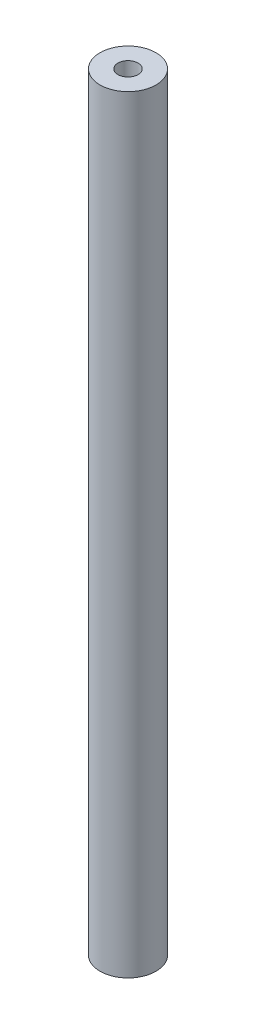
ISO-10303-21;
HEADER;
FILE_DESCRIPTION(('STEP AP214'),'2;1');
FILE_NAME('part.step','',(''),(''),'','','');
FILE_SCHEMA(('AUTOMOTIVE_DESIGN { 1 0 10303 214 1 1 1 1 }'));
ENDSEC;
DATA;
#1=APPLICATION_CONTEXT('core data for automotive mechanical design processes');
#2=APPLICATION_PROTOCOL_DEFINITION('international standard','automotive_design',2000,#1);
#3=PRODUCT_CONTEXT('',#1,'mechanical');
#4=PRODUCT('Part','Part','',(#3));
#5=PRODUCT_RELATED_PRODUCT_CATEGORY('part','',(#4));
#6=PRODUCT_DEFINITION_FORMATION('','',#4);
#7=PRODUCT_DEFINITION_CONTEXT('part definition',#1,'design');
#8=PRODUCT_DEFINITION('design','',#6,#7);
#9=PRODUCT_DEFINITION_SHAPE('','',#8);
#10=(LENGTH_UNIT() NAMED_UNIT(*) SI_UNIT(.MILLI.,.METRE.));
#11=(NAMED_UNIT(*) PLANE_ANGLE_UNIT() SI_UNIT($,.RADIAN.));
#12=(NAMED_UNIT(*) SI_UNIT($,.STERADIAN.) SOLID_ANGLE_UNIT());
#13=UNCERTAINTY_MEASURE_WITH_UNIT(LENGTH_MEASURE(1.E-05),#10,'distance_accuracy_value','');
#14=(GEOMETRIC_REPRESENTATION_CONTEXT(3) GLOBAL_UNCERTAINTY_ASSIGNED_CONTEXT((#13)) GLOBAL_UNIT_ASSIGNED_CONTEXT((#10,
#11,#12)) REPRESENTATION_CONTEXT('',''));
#15=CARTESIAN_POINT('',(0.,0.,0.));
#16=DIRECTION('',(0.,0.,1.));
#17=DIRECTION('',(1.,0.,0.));
#18=AXIS2_PLACEMENT_3D('',#15,#16,#17);
#19=CARTESIAN_POINT('',(0.,152.4,0.));
#20=DIRECTION('',(0.,-1.,0.));
#21=DIRECTION('',(0.,0.,-1.));
#22=AXIS2_PLACEMENT_3D('',#19,#20,#21);
#23=CYLINDRICAL_SURFACE('',#22,5.55625);
#24=CARTESIAN_POINT('',(0.,152.4,0.));
#25=DIRECTION('',(0.,1.,0.));
#26=DIRECTION('',(0.,0.,1.));
#27=AXIS2_PLACEMENT_3D('',#24,#25,#26);
#28=CIRCLE('',#27,5.55625);
#29=CARTESIAN_POINT('',(0.,152.4,-5.55625));
#30=VERTEX_POINT('',#29);
#31=EDGE_CURVE('E10',#30,#30,#28,.T.);
#32=CARTESIAN_POINT('',(0.,0.,0.));
#33=DIRECTION('',(0.,1.,0.));
#34=DIRECTION('',(0.,0.,1.));
#35=AXIS2_PLACEMENT_3D('',#32,#33,#34);
#36=CIRCLE('',#35,5.55625);
#37=CARTESIAN_POINT('',(0.,0.,-5.55625));
#38=VERTEX_POINT('',#37);
#39=EDGE_CURVE('E42',#38,#38,#36,.T.);
#40=CARTESIAN_POINT('',(0.,152.4,-5.55625));
#41=CARTESIAN_POINT('',(0.,150.8125,-5.55625));
#42=CARTESIAN_POINT('',(0.,149.225,-5.55625));
#43=CARTESIAN_POINT('',(0.,146.05,-5.55625));
#44=CARTESIAN_POINT('',(0.,144.4625,-5.55625));
#45=CARTESIAN_POINT('',(0.,141.2875,-5.55625));
#46=CARTESIAN_POINT('',(0.,139.7,-5.55625));
#47=CARTESIAN_POINT('',(0.,136.525,-5.55625));
#48=CARTESIAN_POINT('',(0.,134.9375,-5.55625));
#49=CARTESIAN_POINT('',(0.,131.7625,-5.55625));
#50=CARTESIAN_POINT('',(0.,130.175,-5.55625));
#51=CARTESIAN_POINT('',(0.,127.,-5.55625));
#52=CARTESIAN_POINT('',(0.,125.4125,-5.55625));
#53=CARTESIAN_POINT('',(0.,122.2375,-5.55625));
#54=CARTESIAN_POINT('',(0.,120.65,-5.55625));
#55=CARTESIAN_POINT('',(0.,117.475,-5.55625));
#56=CARTESIAN_POINT('',(0.,115.8875,-5.55625));
#57=CARTESIAN_POINT('',(0.,112.7125,-5.55625));
#58=CARTESIAN_POINT('',(0.,111.125,-5.55625));
#59=CARTESIAN_POINT('',(0.,107.95,-5.55625));
#60=CARTESIAN_POINT('',(0.,106.3625,-5.55625));
#61=CARTESIAN_POINT('',(0.,103.1875,-5.55625));
#62=CARTESIAN_POINT('',(0.,101.6,-5.55625));
#63=CARTESIAN_POINT('',(0.,98.425,-5.55625));
#64=CARTESIAN_POINT('',(0.,96.8375,-5.55625));
#65=CARTESIAN_POINT('',(0.,93.6625,-5.55625));
#66=CARTESIAN_POINT('',(0.,92.075,-5.55625));
#67=CARTESIAN_POINT('',(0.,88.9,-5.55625));
#68=CARTESIAN_POINT('',(0.,87.3125,-5.55625));
#69=CARTESIAN_POINT('',(0.,84.1375,-5.55625));
#70=CARTESIAN_POINT('',(0.,82.55,-5.55625));
#71=CARTESIAN_POINT('',(0.,79.375,-5.55625));
#72=CARTESIAN_POINT('',(0.,77.7875,-5.55625));
#73=CARTESIAN_POINT('',(0.,74.6125,-5.55625));
#74=CARTESIAN_POINT('',(0.,73.025,-5.55625));
#75=CARTESIAN_POINT('',(0.,69.85,-5.55625));
#76=CARTESIAN_POINT('',(0.,68.2625,-5.55625));
#77=CARTESIAN_POINT('',(0.,65.0875,-5.55625));
#78=CARTESIAN_POINT('',(0.,63.5,-5.55625));
#79=CARTESIAN_POINT('',(0.,60.325,-5.55625));
#80=CARTESIAN_POINT('',(0.,58.7375,-5.55625));
#81=CARTESIAN_POINT('',(0.,55.5625,-5.55625));
#82=CARTESIAN_POINT('',(0.,53.975,-5.55625));
#83=CARTESIAN_POINT('',(0.,50.8,-5.55625));
#84=CARTESIAN_POINT('',(0.,49.2125,-5.55625));
#85=CARTESIAN_POINT('',(0.,46.0375,-5.55625));
#86=CARTESIAN_POINT('',(0.,44.45,-5.55625));
#87=CARTESIAN_POINT('',(0.,41.275,-5.55625));
#88=CARTESIAN_POINT('',(0.,39.6875,-5.55625));
#89=CARTESIAN_POINT('',(0.,36.5125,-5.55625));
#90=CARTESIAN_POINT('',(0.,34.925,-5.55625));
#91=CARTESIAN_POINT('',(0.,31.75,-5.55625));
#92=CARTESIAN_POINT('',(0.,30.1625,-5.55625));
#93=CARTESIAN_POINT('',(0.,26.9875,-5.55625));
#94=CARTESIAN_POINT('',(0.,25.4,-5.55625));
#95=CARTESIAN_POINT('',(0.,22.225,-5.55625));
#96=CARTESIAN_POINT('',(0.,20.6375,-5.55625));
#97=CARTESIAN_POINT('',(0.,17.4625,-5.55625));
#98=CARTESIAN_POINT('',(0.,15.875,-5.55625));
#99=CARTESIAN_POINT('',(0.,12.7,-5.55625));
#100=CARTESIAN_POINT('',(0.,11.1125,-5.55625));
#101=CARTESIAN_POINT('',(0.,7.93750000000001,-5.55625));
#102=CARTESIAN_POINT('',(0.,6.35,-5.55625));
#103=CARTESIAN_POINT('',(0.,3.175,-5.55625));
#104=CARTESIAN_POINT('',(0.,1.5875,-5.55625));
#105=CARTESIAN_POINT('',(0.,0.,-5.55625));
#106=B_SPLINE_CURVE_WITH_KNOTS('',3,(#40,#41,#42,#43,#44,#45,#46,#47,#48,#49,#50,#51,#52,#53,
#54,#55,#56,#57,#58,#59,#60,#61,#62,#63,#64,#65,#66,#67,#68,#69,#70,#71,#72,#73,#74,#75,#76,#77,
#78,#79,#80,#81,#82,#83,#84,#85,#86,#87,#88,#89,#90,#91,#92,#93,#94,#95,#96,#97,#98,#99,#100,
#101,#102,#103,#104,#105),.UNSPECIFIED.,.F.,.F.,(4,2,2,2,2,2,2,2,2,2,2,2,2,2,2,2,2,2,2,2,2,2,2,
2,2,2,2,2,2,2,2,2,4),(0.,4.76249999999998,9.52499999999998,14.2875,19.05,23.8125,28.575,33.3375,
38.1,42.8625,47.625,52.3875,57.15,61.9125,66.675,71.4375,76.2,80.9625,85.725,90.4875,95.25,
100.0125,104.775,109.5375,114.3,119.0625,123.825,128.5875,133.35,138.1125,142.875,147.6375,
152.4),.UNSPECIFIED.);
#107=EDGE_CURVE('BSEAM39',#30,#38,#106,.T.);
#108=ORIENTED_EDGE('',*,*,#31,.F.);
#109=ORIENTED_EDGE('',*,*,#39,.T.);
#110=ORIENTED_EDGE('',*,*,#107,.T.);
#111=ORIENTED_EDGE('',*,*,#107,.F.);
#112=EDGE_LOOP('',(#108,#110,#109,#111));
#113=FACE_BOUND('',#112,.T.);
#114=ADVANCED_FACE('F39',(#113),#23,.T.);
#115=CARTESIAN_POINT('',(0.,152.4,0.));
#116=DIRECTION('',(0.,1.,0.));
#117=DIRECTION('',(0.,0.,1.));
#118=AXIS2_PLACEMENT_3D('',#115,#116,#117);
#119=PLANE('',#118);
#120=CARTESIAN_POINT('',(0.,152.4,0.));
#121=DIRECTION('',(0.,1.,0.));
#122=DIRECTION('',(0.,0.,1.));
#123=AXIS2_PLACEMENT_3D('',#120,#121,#122);
#124=CIRCLE('',#123,2.);
#125=CARTESIAN_POINT('',(0.,152.4,2.));
#126=VERTEX_POINT('',#125);
#127=EDGE_CURVE('E51',#126,#126,#124,.T.);
#128=ORIENTED_EDGE('',*,*,#127,.F.);
#129=EDGE_LOOP('',(#128));
#130=FACE_BOUND('',#129,.T.);
#131=ORIENTED_EDGE('',*,*,#31,.T.);
#132=EDGE_LOOP('',(#131));
#133=FACE_BOUND('',#132,.T.);
#134=ADVANCED_FACE('F76',(#130,#133),#119,.T.);
#135=CARTESIAN_POINT('',(0.,0.,0.));
#136=DIRECTION('',(0.,1.,0.));
#137=DIRECTION('',(0.,0.,1.));
#138=AXIS2_PLACEMENT_3D('',#135,#136,#137);
#139=PLANE('',#138);
#140=CARTESIAN_POINT('',(0.,0.,0.));
#141=DIRECTION('',(0.,-1.,0.));
#142=DIRECTION('',(0.,0.,-1.));
#143=AXIS2_PLACEMENT_3D('',#140,#141,#142);
#144=CIRCLE('',#143,2.);
#145=CARTESIAN_POINT('',(0.,0.,-2.));
#146=VERTEX_POINT('',#145);
#147=EDGE_CURVE('E57',#146,#146,#144,.T.);
#148=ORIENTED_EDGE('',*,*,#147,.F.);
#149=EDGE_LOOP('',(#148));
#150=FACE_BOUND('',#149,.T.);
#151=ORIENTED_EDGE('',*,*,#39,.F.);
#152=EDGE_LOOP('',(#151));
#153=FACE_BOUND('',#152,.T.);
#154=ADVANCED_FACE('F72',(#150,#153),#139,.F.);
#155=CARTESIAN_POINT('',(0.,145.4,0.));
#156=DIRECTION('',(0.,1.,0.));
#157=DIRECTION('',(0.,0.,1.));
#158=AXIS2_PLACEMENT_3D('',#155,#156,#157);
#159=CYLINDRICAL_SURFACE('',#158,2.);
#160=CARTESIAN_POINT('',(0.,145.4,0.));
#161=DIRECTION('',(0.,1.,0.));
#162=DIRECTION('',(0.,0.,1.));
#163=AXIS2_PLACEMENT_3D('',#160,#161,#162);
#164=CIRCLE('',#163,2.);
#165=CARTESIAN_POINT('',(0.,145.4,2.));
#166=VERTEX_POINT('',#165);
#167=EDGE_CURVE('E49',#166,#166,#164,.T.);
#168=ORIENTED_EDGE('',*,*,#167,.F.);
#169=EDGE_LOOP('',(#168));
#170=FACE_BOUND('',#169,.T.);
#171=ORIENTED_EDGE('',*,*,#127,.T.);
#172=EDGE_LOOP('',(#171));
#173=FACE_BOUND('',#172,.T.);
#174=ADVANCED_FACE('F75',(#170,#173),#159,.F.);
#175=CARTESIAN_POINT('',(0.,145.4,0.));
#176=DIRECTION('',(0.,1.,0.));
#177=DIRECTION('',(0.,0.,1.));
#178=AXIS2_PLACEMENT_3D('',#175,#176,#177);
#179=PLANE('',#178);
#180=ORIENTED_EDGE('',*,*,#167,.T.);
#181=EDGE_LOOP('',(#180));
#182=FACE_BOUND('',#181,.T.);
#183=ADVANCED_FACE('F68',(#182),#179,.T.);
#184=CARTESIAN_POINT('',(0.,7.,0.));
#185=DIRECTION('',(0.,-1.,0.));
#186=DIRECTION('',(0.,0.,-1.));
#187=AXIS2_PLACEMENT_3D('',#184,#185,#186);
#188=CYLINDRICAL_SURFACE('',#187,2.);
#189=CARTESIAN_POINT('',(0.,7.,0.));
#190=DIRECTION('',(0.,-1.,0.));
#191=DIRECTION('',(0.,0.,-1.));
#192=AXIS2_PLACEMENT_3D('',#189,#190,#191);
#193=CIRCLE('',#192,2.);
#194=CARTESIAN_POINT('',(0.,7.,-2.));
#195=VERTEX_POINT('',#194);
#196=EDGE_CURVE('E54',#195,#195,#193,.T.);
#197=ORIENTED_EDGE('',*,*,#196,.F.);
#198=EDGE_LOOP('',(#197));
#199=FACE_BOUND('',#198,.T.);
#200=ORIENTED_EDGE('',*,*,#147,.T.);
#201=EDGE_LOOP('',(#200));
#202=FACE_BOUND('',#201,.T.);
#203=ADVANCED_FACE('F65',(#199,#202),#188,.F.);
#204=CARTESIAN_POINT('',(0.,7.,0.));
#205=DIRECTION('',(0.,-1.,0.));
#206=DIRECTION('',(0.,0.,-1.));
#207=AXIS2_PLACEMENT_3D('',#204,#205,#206);
#208=PLANE('',#207);
#209=ORIENTED_EDGE('',*,*,#196,.T.);
#210=EDGE_LOOP('',(#209));
#211=FACE_BOUND('',#210,.T.);
#212=ADVANCED_FACE('F63',(#211),#208,.T.);
#213=CLOSED_SHELL('',(#114,#134,#154,#174,#183,#203,#212));
#214=MANIFOLD_SOLID_BREP('B2',#213);
#215=ADVANCED_BREP_SHAPE_REPRESENTATION('',(#18,#214),#14);
#216=SHAPE_DEFINITION_REPRESENTATION(#9,#215);
ENDSEC;
END-ISO-10303-21;
